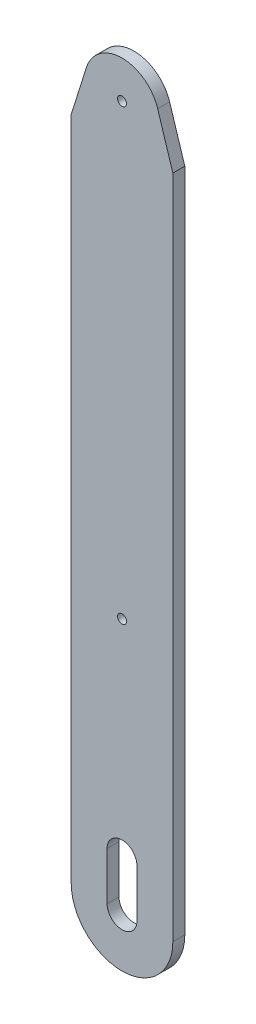
ISO-10303-21;
HEADER;
FILE_DESCRIPTION(('STEP AP214'),'2;1');
FILE_NAME('part.step','',(''),(''),'','','');
FILE_SCHEMA(('AUTOMOTIVE_DESIGN { 1 0 10303 214 1 1 1 1 }'));
ENDSEC;
DATA;
#1=APPLICATION_CONTEXT('core data for automotive mechanical design processes');
#2=APPLICATION_PROTOCOL_DEFINITION('international standard','automotive_design',2000,#1);
#3=PRODUCT_CONTEXT('',#1,'mechanical');
#4=PRODUCT('Part','Part','',(#3));
#5=PRODUCT_RELATED_PRODUCT_CATEGORY('part','',(#4));
#6=PRODUCT_DEFINITION_FORMATION('','',#4);
#7=PRODUCT_DEFINITION_CONTEXT('part definition',#1,'design');
#8=PRODUCT_DEFINITION('design','',#6,#7);
#9=PRODUCT_DEFINITION_SHAPE('','',#8);
#10=(LENGTH_UNIT() NAMED_UNIT(*) SI_UNIT(.MILLI.,.METRE.));
#11=(NAMED_UNIT(*) PLANE_ANGLE_UNIT() SI_UNIT($,.RADIAN.));
#12=(NAMED_UNIT(*) SI_UNIT($,.STERADIAN.) SOLID_ANGLE_UNIT());
#13=UNCERTAINTY_MEASURE_WITH_UNIT(LENGTH_MEASURE(1.E-05),#10,'distance_accuracy_value','');
#14=(GEOMETRIC_REPRESENTATION_CONTEXT(3) GLOBAL_UNCERTAINTY_ASSIGNED_CONTEXT((#13)) GLOBAL_UNIT_ASSIGNED_CONTEXT((#10,
#11,#12)) REPRESENTATION_CONTEXT('',''));
#15=CARTESIAN_POINT('',(0.,0.,0.));
#16=DIRECTION('',(0.,0.,1.));
#17=DIRECTION('',(1.,0.,0.));
#18=AXIS2_PLACEMENT_3D('',#15,#16,#17);
#19=CARTESIAN_POINT('',(0.,-235.,-4.));
#20=DIRECTION('',(0.,0.,1.));
#21=DIRECTION('',(1.,0.,0.));
#22=AXIS2_PLACEMENT_3D('',#19,#20,#21);
#23=CYLINDRICAL_SURFACE('',#22,17.);
#24=CARTESIAN_POINT('',(0.,-235.,0.));
#25=DIRECTION('',(0.,0.,1.));
#26=DIRECTION('',(1.,0.,0.));
#27=AXIS2_PLACEMENT_3D('',#24,#25,#26);
#28=CIRCLE('',#27,17.);
#29=CARTESIAN_POINT('',(-17.,-235.,0.));
#30=VERTEX_POINT('',#29);
#31=CARTESIAN_POINT('',(17.,-235.,0.));
#32=VERTEX_POINT('',#31);
#33=EDGE_CURVE('E162',#30,#32,#28,.T.);
#34=ORIENTED_EDGE('',*,*,#33,.F.);
#35=DIRECTION('',(0.,0.,1.));
#36=VECTOR('',#35,1.);
#37=CARTESIAN_POINT('',(-17.,-235.,-4.));
#38=LINE('',#37,#36);
#39=CARTESIAN_POINT('',(-17.,-235.,-4.));
#40=VERTEX_POINT('',#39);
#41=EDGE_CURVE('E11',#40,#30,#38,.T.);
#42=ORIENTED_EDGE('',*,*,#41,.F.);
#43=CARTESIAN_POINT('',(0.,-235.,-4.));
#44=DIRECTION('',(0.,0.,1.));
#45=DIRECTION('',(1.,0.,0.));
#46=AXIS2_PLACEMENT_3D('',#43,#44,#45);
#47=CIRCLE('',#46,17.);
#48=CARTESIAN_POINT('',(17.,-235.,-4.));
#49=VERTEX_POINT('',#48);
#50=EDGE_CURVE('E165',#40,#49,#47,.T.);
#51=ORIENTED_EDGE('',*,*,#50,.T.);
#52=DIRECTION('',(0.,0.,1.));
#53=VECTOR('',#52,1.);
#54=CARTESIAN_POINT('',(17.,-235.,-4.));
#55=LINE('',#54,#53);
#56=EDGE_CURVE('E42',#49,#32,#55,.T.);
#57=ORIENTED_EDGE('',*,*,#56,.T.);
#58=EDGE_LOOP('',(#34,#42,#51,#57));
#59=FACE_BOUND('',#58,.T.);
#60=ADVANCED_FACE('F39',(#59),#23,.T.);
#61=CARTESIAN_POINT('',(-17.,-12.3482425973866,-4.));
#62=DIRECTION('',(-1.,0.,0.));
#63=DIRECTION('',(0.,-1.,0.));
#64=AXIS2_PLACEMENT_3D('',#61,#62,#63);
#65=PLANE('',#64);
#66=DIRECTION('',(0.,-1.,0.));
#67=VECTOR('',#66,1.);
#68=CARTESIAN_POINT('',(-17.,-12.3482425973866,0.));
#69=LINE('',#68,#67);
#70=CARTESIAN_POINT('',(-17.,-12.3482425973866,0.));
#71=VERTEX_POINT('',#70);
#72=EDGE_CURVE('E169',#71,#30,#69,.T.);
#73=ORIENTED_EDGE('',*,*,#72,.F.);
#74=DIRECTION('',(0.,0.,1.));
#75=VECTOR('',#74,1.);
#76=CARTESIAN_POINT('',(-17.,-12.3482425973866,-4.));
#77=LINE('',#76,#75);
#78=CARTESIAN_POINT('',(-17.,-12.3482425973866,-4.));
#79=VERTEX_POINT('',#78);
#80=EDGE_CURVE('E47',#79,#71,#77,.T.);
#81=ORIENTED_EDGE('',*,*,#80,.F.);
#82=DIRECTION('',(0.,-1.,0.));
#83=VECTOR('',#82,1.);
#84=CARTESIAN_POINT('',(-17.,-12.3482425973866,-4.));
#85=LINE('',#84,#83);
#86=EDGE_CURVE('E181',#79,#40,#85,.T.);
#87=ORIENTED_EDGE('',*,*,#86,.T.);
#88=ORIENTED_EDGE('',*,*,#41,.T.);
#89=EDGE_LOOP('',(#73,#81,#87,#88));
#90=FACE_BOUND('',#89,.T.);
#91=ADVANCED_FACE('F218',(#90),#65,.T.);
#92=CARTESIAN_POINT('',(-11.9214618843528,3.75882249380342,-4.));
#93=DIRECTION('',(-0.953716950748227,0.300705799504274,0.));
#94=DIRECTION('',(-0.300705799504274,-0.953716950748227,0.));
#95=AXIS2_PLACEMENT_3D('',#92,#93,#94);
#96=PLANE('',#95);
#97=DIRECTION('',(-0.300705799504274,-0.953716950748227,0.));
#98=VECTOR('',#97,1.);
#99=CARTESIAN_POINT('',(-11.9214618843528,3.75882249380342,0.));
#100=LINE('',#99,#98);
#101=CARTESIAN_POINT('',(-11.9214618843528,3.75882249380342,0.));
#102=VERTEX_POINT('',#101);
#103=EDGE_CURVE('E195',#102,#71,#100,.T.);
#104=ORIENTED_EDGE('',*,*,#103,.F.);
#105=DIRECTION('',(0.,0.,1.));
#106=VECTOR('',#105,1.);
#107=CARTESIAN_POINT('',(-11.9214618843528,3.75882249380342,-4.));
#108=LINE('',#107,#106);
#109=CARTESIAN_POINT('',(-11.9214618843528,3.75882249380342,-4.));
#110=VERTEX_POINT('',#109);
#111=EDGE_CURVE('E201',#110,#102,#108,.T.);
#112=ORIENTED_EDGE('',*,*,#111,.F.);
#113=DIRECTION('',(-0.300705799504274,-0.953716950748227,0.));
#114=VECTOR('',#113,1.);
#115=CARTESIAN_POINT('',(-11.9214618843528,3.75882249380342,-4.));
#116=LINE('',#115,#114);
#117=EDGE_CURVE('E178',#110,#79,#116,.T.);
#118=ORIENTED_EDGE('',*,*,#117,.T.);
#119=ORIENTED_EDGE('',*,*,#80,.T.);
#120=EDGE_LOOP('',(#104,#112,#118,#119));
#121=FACE_BOUND('',#120,.T.);
#122=ADVANCED_FACE('F230',(#121),#96,.T.);
#123=CARTESIAN_POINT('',(0.,0.,-4.));
#124=DIRECTION('',(0.,0.,1.));
#125=DIRECTION('',(1.,0.,0.));
#126=AXIS2_PLACEMENT_3D('',#123,#124,#125);
#127=CYLINDRICAL_SURFACE('',#126,12.5);
#128=CARTESIAN_POINT('',(0.,0.,0.));
#129=DIRECTION('',(0.,0.,1.));
#130=DIRECTION('',(1.,0.,0.));
#131=AXIS2_PLACEMENT_3D('',#128,#129,#130);
#132=CIRCLE('',#131,12.5);
#133=CARTESIAN_POINT('',(11.9214618843528,3.75882249380342,0.));
#134=VERTEX_POINT('',#133);
#135=EDGE_CURVE('E192',#134,#102,#132,.T.);
#136=ORIENTED_EDGE('',*,*,#135,.F.);
#137=DIRECTION('',(0.,0.,1.));
#138=VECTOR('',#137,1.);
#139=CARTESIAN_POINT('',(11.9214618843528,3.75882249380342,-4.));
#140=LINE('',#139,#138);
#141=CARTESIAN_POINT('',(11.9214618843528,3.75882249380342,-4.));
#142=VERTEX_POINT('',#141);
#143=EDGE_CURVE('E203',#142,#134,#140,.T.);
#144=ORIENTED_EDGE('',*,*,#143,.F.);
#145=CARTESIAN_POINT('',(0.,0.,-4.));
#146=DIRECTION('',(0.,0.,1.));
#147=DIRECTION('',(1.,0.,0.));
#148=AXIS2_PLACEMENT_3D('',#145,#146,#147);
#149=CIRCLE('',#148,12.5);
#150=EDGE_CURVE('E175',#142,#110,#149,.T.);
#151=ORIENTED_EDGE('',*,*,#150,.T.);
#152=ORIENTED_EDGE('',*,*,#111,.T.);
#153=EDGE_LOOP('',(#136,#144,#151,#152));
#154=FACE_BOUND('',#153,.T.);
#155=ADVANCED_FACE('F228',(#154),#127,.T.);
#156=CARTESIAN_POINT('',(11.9214618843528,3.75882249380342,-4.));
#157=DIRECTION('',(0.953716950748227,0.300705799504274,0.));
#158=DIRECTION('',(-0.300705799504274,0.953716950748227,0.));
#159=AXIS2_PLACEMENT_3D('',#156,#157,#158);
#160=PLANE('',#159);
#161=DIRECTION('',(-0.300705799504274,0.953716950748227,0.));
#162=VECTOR('',#161,1.);
#163=CARTESIAN_POINT('',(11.9214618843528,3.75882249380342,0.));
#164=LINE('',#163,#162);
#165=CARTESIAN_POINT('',(17.,-12.3482425973866,0.));
#166=VERTEX_POINT('',#165);
#167=EDGE_CURVE('E189',#166,#134,#164,.T.);
#168=ORIENTED_EDGE('',*,*,#167,.F.);
#169=DIRECTION('',(0.,0.,1.));
#170=VECTOR('',#169,1.);
#171=CARTESIAN_POINT('',(17.,-12.3482425973866,-4.));
#172=LINE('',#171,#170);
#173=CARTESIAN_POINT('',(17.,-12.3482425973866,-4.));
#174=VERTEX_POINT('',#173);
#175=EDGE_CURVE('E204',#174,#166,#172,.T.);
#176=ORIENTED_EDGE('',*,*,#175,.F.);
#177=DIRECTION('',(-0.300705799504274,0.953716950748227,0.));
#178=VECTOR('',#177,1.);
#179=CARTESIAN_POINT('',(11.9214618843528,3.75882249380342,-4.));
#180=LINE('',#179,#178);
#181=EDGE_CURVE('E172',#174,#142,#180,.T.);
#182=ORIENTED_EDGE('',*,*,#181,.T.);
#183=ORIENTED_EDGE('',*,*,#143,.T.);
#184=EDGE_LOOP('',(#168,#176,#182,#183));
#185=FACE_BOUND('',#184,.T.);
#186=ADVANCED_FACE('F225',(#185),#160,.T.);
#187=CARTESIAN_POINT('',(17.,-12.3482425973866,-4.));
#188=DIRECTION('',(1.,0.,0.));
#189=DIRECTION('',(0.,1.,0.));
#190=AXIS2_PLACEMENT_3D('',#187,#188,#189);
#191=PLANE('',#190);
#192=DIRECTION('',(0.,1.,0.));
#193=VECTOR('',#192,1.);
#194=CARTESIAN_POINT('',(17.,-12.3482425973866,0.));
#195=LINE('',#194,#193);
#196=EDGE_CURVE('E186',#32,#166,#195,.T.);
#197=ORIENTED_EDGE('',*,*,#196,.F.);
#198=ORIENTED_EDGE('',*,*,#56,.F.);
#199=DIRECTION('',(0.,1.,0.));
#200=VECTOR('',#199,1.);
#201=CARTESIAN_POINT('',(17.,-12.3482425973866,-4.));
#202=LINE('',#201,#200);
#203=EDGE_CURVE('E168',#49,#174,#202,.T.);
#204=ORIENTED_EDGE('',*,*,#203,.T.);
#205=ORIENTED_EDGE('',*,*,#175,.T.);
#206=EDGE_LOOP('',(#197,#198,#204,#205));
#207=FACE_BOUND('',#206,.T.);
#208=ADVANCED_FACE('F212',(#207),#191,.T.);
#209=CARTESIAN_POINT('',(0.,-235.,-4.));
#210=DIRECTION('',(0.,0.,1.));
#211=DIRECTION('',(1.,0.,0.));
#212=AXIS2_PLACEMENT_3D('',#209,#210,#211);
#213=PLANE('',#212);
#214=DIRECTION('',(0.,-1.,0.));
#215=VECTOR('',#214,1.);
#216=CARTESIAN_POINT('',(-5.,-235.,-4.));
#217=LINE('',#216,#215);
#218=CARTESIAN_POINT('',(-5.,-219.,-4.));
#219=VERTEX_POINT('',#218);
#220=CARTESIAN_POINT('',(-5.,-235.,-4.));
#221=VERTEX_POINT('',#220);
#222=EDGE_CURVE('E124',#219,#221,#217,.T.);
#223=ORIENTED_EDGE('',*,*,#222,.T.);
#224=CARTESIAN_POINT('',(0.,-235.,-4.));
#225=DIRECTION('',(0.,0.,1.));
#226=DIRECTION('',(1.,0.,0.));
#227=AXIS2_PLACEMENT_3D('',#224,#225,#226);
#228=CIRCLE('',#227,5.);
#229=CARTESIAN_POINT('',(5.,-235.,-4.));
#230=VERTEX_POINT('',#229);
#231=EDGE_CURVE('E118',#221,#230,#228,.T.);
#232=ORIENTED_EDGE('',*,*,#231,.T.);
#233=DIRECTION('',(0.,1.,0.));
#234=VECTOR('',#233,1.);
#235=CARTESIAN_POINT('',(5.,-235.,-4.));
#236=LINE('',#235,#234);
#237=CARTESIAN_POINT('',(5.,-219.,-4.));
#238=VERTEX_POINT('',#237);
#239=EDGE_CURVE('E127',#230,#238,#236,.T.);
#240=ORIENTED_EDGE('',*,*,#239,.T.);
#241=CARTESIAN_POINT('',(0.,-219.,-4.));
#242=DIRECTION('',(0.,0.,1.));
#243=DIRECTION('',(1.,0.,0.));
#244=AXIS2_PLACEMENT_3D('',#241,#242,#243);
#245=CIRCLE('',#244,5.);
#246=EDGE_CURVE('E55',#238,#219,#245,.T.);
#247=ORIENTED_EDGE('',*,*,#246,.T.);
#248=EDGE_LOOP('',(#223,#232,#240,#247));
#249=FACE_BOUND('',#248,.T.);
#250=CARTESIAN_POINT('',(0.,-150.,-4.));
#251=DIRECTION('',(0.,0.,1.));
#252=DIRECTION('',(1.,0.,0.));
#253=AXIS2_PLACEMENT_3D('',#250,#251,#252);
#254=CIRCLE('',#253,1.5);
#255=CARTESIAN_POINT('',(1.5,-150.,-4.));
#256=VERTEX_POINT('',#255);
#257=EDGE_CURVE('E153',#256,#256,#254,.T.);
#258=ORIENTED_EDGE('',*,*,#257,.T.);
#259=EDGE_LOOP('',(#258));
#260=FACE_BOUND('',#259,.T.);
#261=CARTESIAN_POINT('',(0.,0.,-4.));
#262=DIRECTION('',(0.,0.,1.));
#263=DIRECTION('',(1.,0.,0.));
#264=AXIS2_PLACEMENT_3D('',#261,#262,#263);
#265=CIRCLE('',#264,1.5);
#266=CARTESIAN_POINT('',(1.5,0.,-4.));
#267=VERTEX_POINT('',#266);
#268=EDGE_CURVE('E159',#267,#267,#265,.T.);
#269=ORIENTED_EDGE('',*,*,#268,.T.);
#270=EDGE_LOOP('',(#269));
#271=FACE_BOUND('',#270,.T.);
#272=ORIENTED_EDGE('',*,*,#50,.F.);
#273=ORIENTED_EDGE('',*,*,#86,.F.);
#274=ORIENTED_EDGE('',*,*,#117,.F.);
#275=ORIENTED_EDGE('',*,*,#150,.F.);
#276=ORIENTED_EDGE('',*,*,#181,.F.);
#277=ORIENTED_EDGE('',*,*,#203,.F.);
#278=EDGE_LOOP('',(#272,#273,#274,#275,#276,#277));
#279=FACE_BOUND('',#278,.T.);
#280=ADVANCED_FACE('F131',(#249,#260,#271,#279),#213,.F.);
#281=CARTESIAN_POINT('',(0.,-235.,0.));
#282=DIRECTION('',(0.,0.,1.));
#283=DIRECTION('',(1.,0.,0.));
#284=AXIS2_PLACEMENT_3D('',#281,#282,#283);
#285=PLANE('',#284);
#286=CARTESIAN_POINT('',(0.,-235.,0.));
#287=DIRECTION('',(0.,0.,1.));
#288=DIRECTION('',(1.,0.,0.));
#289=AXIS2_PLACEMENT_3D('',#286,#287,#288);
#290=CIRCLE('',#289,5.);
#291=CARTESIAN_POINT('',(-5.,-235.,0.));
#292=VERTEX_POINT('',#291);
#293=CARTESIAN_POINT('',(5.,-235.,0.));
#294=VERTEX_POINT('',#293);
#295=EDGE_CURVE('E63',#292,#294,#290,.T.);
#296=ORIENTED_EDGE('',*,*,#295,.F.);
#297=DIRECTION('',(0.,-1.,0.));
#298=VECTOR('',#297,1.);
#299=CARTESIAN_POINT('',(-5.,-235.,0.));
#300=LINE('',#299,#298);
#301=CARTESIAN_POINT('',(-5.,-219.,0.));
#302=VERTEX_POINT('',#301);
#303=EDGE_CURVE('E134',#302,#292,#300,.T.);
#304=ORIENTED_EDGE('',*,*,#303,.F.);
#305=CARTESIAN_POINT('',(0.,-219.,0.));
#306=DIRECTION('',(0.,0.,1.));
#307=DIRECTION('',(1.,0.,0.));
#308=AXIS2_PLACEMENT_3D('',#305,#306,#307);
#309=CIRCLE('',#308,5.);
#310=CARTESIAN_POINT('',(5.,-219.,0.));
#311=VERTEX_POINT('',#310);
#312=EDGE_CURVE('E137',#311,#302,#309,.T.);
#313=ORIENTED_EDGE('',*,*,#312,.F.);
#314=DIRECTION('',(0.,1.,0.));
#315=VECTOR('',#314,1.);
#316=CARTESIAN_POINT('',(5.,-235.,0.));
#317=LINE('',#316,#315);
#318=EDGE_CURVE('E143',#294,#311,#317,.T.);
#319=ORIENTED_EDGE('',*,*,#318,.F.);
#320=EDGE_LOOP('',(#296,#304,#313,#319));
#321=FACE_BOUND('',#320,.T.);
#322=CARTESIAN_POINT('',(0.,-150.,0.));
#323=DIRECTION('',(0.,0.,1.));
#324=DIRECTION('',(1.,0.,0.));
#325=AXIS2_PLACEMENT_3D('',#322,#323,#324);
#326=CIRCLE('',#325,1.5);
#327=CARTESIAN_POINT('',(1.5,-150.,0.));
#328=VERTEX_POINT('',#327);
#329=EDGE_CURVE('E149',#328,#328,#326,.T.);
#330=ORIENTED_EDGE('',*,*,#329,.F.);
#331=EDGE_LOOP('',(#330));
#332=FACE_BOUND('',#331,.T.);
#333=CARTESIAN_POINT('',(0.,0.,0.));
#334=DIRECTION('',(0.,0.,1.));
#335=DIRECTION('',(1.,0.,0.));
#336=AXIS2_PLACEMENT_3D('',#333,#334,#335);
#337=CIRCLE('',#336,1.5);
#338=CARTESIAN_POINT('',(1.5,0.,0.));
#339=VERTEX_POINT('',#338);
#340=EDGE_CURVE('E156',#339,#339,#337,.T.);
#341=ORIENTED_EDGE('',*,*,#340,.F.);
#342=EDGE_LOOP('',(#341));
#343=FACE_BOUND('',#342,.T.);
#344=ORIENTED_EDGE('',*,*,#33,.T.);
#345=ORIENTED_EDGE('',*,*,#196,.T.);
#346=ORIENTED_EDGE('',*,*,#167,.T.);
#347=ORIENTED_EDGE('',*,*,#135,.T.);
#348=ORIENTED_EDGE('',*,*,#103,.T.);
#349=ORIENTED_EDGE('',*,*,#72,.T.);
#350=EDGE_LOOP('',(#344,#345,#346,#347,#348,#349));
#351=FACE_BOUND('',#350,.T.);
#352=ADVANCED_FACE('F214',(#321,#332,#343,#351),#285,.T.);
#353=CARTESIAN_POINT('',(0.,0.,-4.));
#354=DIRECTION('',(0.,0.,1.));
#355=DIRECTION('',(1.,0.,0.));
#356=AXIS2_PLACEMENT_3D('',#353,#354,#355);
#357=CYLINDRICAL_SURFACE('',#356,1.5);
#358=ORIENTED_EDGE('',*,*,#268,.F.);
#359=EDGE_LOOP('',(#358));
#360=FACE_BOUND('',#359,.T.);
#361=ORIENTED_EDGE('',*,*,#340,.T.);
#362=EDGE_LOOP('',(#361));
#363=FACE_BOUND('',#362,.T.);
#364=ADVANCED_FACE('F294',(#360,#363),#357,.F.);
#365=CARTESIAN_POINT('',(0.,-150.,-4.));
#366=DIRECTION('',(0.,0.,1.));
#367=DIRECTION('',(1.,0.,0.));
#368=AXIS2_PLACEMENT_3D('',#365,#366,#367);
#369=CYLINDRICAL_SURFACE('',#368,1.5);
#370=ORIENTED_EDGE('',*,*,#257,.F.);
#371=EDGE_LOOP('',(#370));
#372=FACE_BOUND('',#371,.T.);
#373=ORIENTED_EDGE('',*,*,#329,.T.);
#374=EDGE_LOOP('',(#373));
#375=FACE_BOUND('',#374,.T.);
#376=ADVANCED_FACE('F305',(#372,#375),#369,.F.);
#377=CARTESIAN_POINT('',(0.,-235.,-4.));
#378=DIRECTION('',(0.,0.,1.));
#379=DIRECTION('',(1.,0.,0.));
#380=AXIS2_PLACEMENT_3D('',#377,#378,#379);
#381=CYLINDRICAL_SURFACE('',#380,5.);
#382=ORIENTED_EDGE('',*,*,#295,.T.);
#383=DIRECTION('',(0.,0.,1.));
#384=VECTOR('',#383,1.);
#385=CARTESIAN_POINT('',(5.,-235.,-4.));
#386=LINE('',#385,#384);
#387=EDGE_CURVE('E114',#230,#294,#386,.T.);
#388=ORIENTED_EDGE('',*,*,#387,.F.);
#389=ORIENTED_EDGE('',*,*,#231,.F.);
#390=DIRECTION('',(0.,0.,1.));
#391=VECTOR('',#390,1.);
#392=CARTESIAN_POINT('',(-5.,-235.,-4.));
#393=LINE('',#392,#391);
#394=EDGE_CURVE('E147',#221,#292,#393,.T.);
#395=ORIENTED_EDGE('',*,*,#394,.T.);
#396=EDGE_LOOP('',(#382,#388,#389,#395));
#397=FACE_BOUND('',#396,.T.);
#398=ADVANCED_FACE('F116',(#397),#381,.F.);
#399=CARTESIAN_POINT('',(-5.,-235.,-4.));
#400=DIRECTION('',(-1.,0.,0.));
#401=DIRECTION('',(0.,0.,1.));
#402=AXIS2_PLACEMENT_3D('',#399,#400,#401);
#403=PLANE('',#402);
#404=ORIENTED_EDGE('',*,*,#303,.T.);
#405=ORIENTED_EDGE('',*,*,#394,.F.);
#406=ORIENTED_EDGE('',*,*,#222,.F.);
#407=DIRECTION('',(0.,0.,1.));
#408=VECTOR('',#407,1.);
#409=CARTESIAN_POINT('',(-5.,-219.,-4.));
#410=LINE('',#409,#408);
#411=EDGE_CURVE('E150',#219,#302,#410,.T.);
#412=ORIENTED_EDGE('',*,*,#411,.T.);
#413=EDGE_LOOP('',(#404,#405,#406,#412));
#414=FACE_BOUND('',#413,.T.);
#415=ADVANCED_FACE('F326',(#414),#403,.F.);
#416=CARTESIAN_POINT('',(0.,-219.,-4.));
#417=DIRECTION('',(0.,0.,1.));
#418=DIRECTION('',(1.,0.,0.));
#419=AXIS2_PLACEMENT_3D('',#416,#417,#418);
#420=CYLINDRICAL_SURFACE('',#419,5.);
#421=ORIENTED_EDGE('',*,*,#312,.T.);
#422=ORIENTED_EDGE('',*,*,#411,.F.);
#423=ORIENTED_EDGE('',*,*,#246,.F.);
#424=DIRECTION('',(0.,0.,1.));
#425=VECTOR('',#424,1.);
#426=CARTESIAN_POINT('',(5.,-219.,-4.));
#427=LINE('',#426,#425);
#428=EDGE_CURVE('E123',#238,#311,#427,.T.);
#429=ORIENTED_EDGE('',*,*,#428,.T.);
#430=EDGE_LOOP('',(#421,#422,#423,#429));
#431=FACE_BOUND('',#430,.T.);
#432=ADVANCED_FACE('F336',(#431),#420,.F.);
#433=CARTESIAN_POINT('',(5.,-235.,-4.));
#434=DIRECTION('',(1.,0.,0.));
#435=DIRECTION('',(0.,0.,-1.));
#436=AXIS2_PLACEMENT_3D('',#433,#434,#435);
#437=PLANE('',#436);
#438=ORIENTED_EDGE('',*,*,#318,.T.);
#439=ORIENTED_EDGE('',*,*,#428,.F.);
#440=ORIENTED_EDGE('',*,*,#239,.F.);
#441=ORIENTED_EDGE('',*,*,#387,.T.);
#442=EDGE_LOOP('',(#438,#439,#440,#441));
#443=FACE_BOUND('',#442,.T.);
#444=ADVANCED_FACE('F128',(#443),#437,.F.);
#445=CLOSED_SHELL('',(#60,#91,#122,#155,#186,#208,#280,#352,#364,#376,#398,#415,#432,#444));
#446=MANIFOLD_SOLID_BREP('B2',#445);
#447=ADVANCED_BREP_SHAPE_REPRESENTATION('',(#18,#446),#14);
#448=SHAPE_DEFINITION_REPRESENTATION(#9,#447);
ENDSEC;
END-ISO-10303-21;
